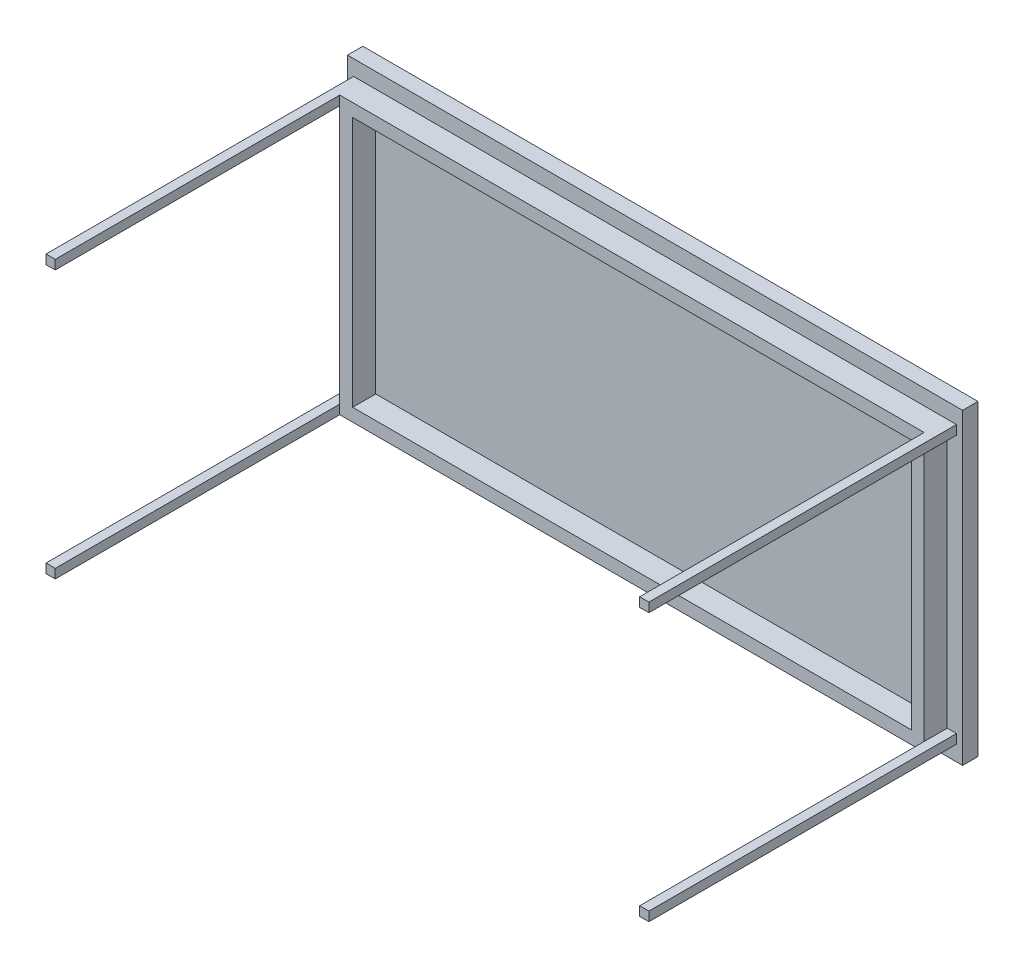
ISO-10303-21;
HEADER;
FILE_DESCRIPTION(('STEP AP214'),'2;1');
FILE_NAME('part.step','',(''),(''),'','','');
FILE_SCHEMA(('AUTOMOTIVE_DESIGN { 1 0 10303 214 1 1 1 1 }'));
ENDSEC;
DATA;
#1=APPLICATION_CONTEXT('core data for automotive mechanical design processes');
#2=APPLICATION_PROTOCOL_DEFINITION('international standard','automotive_design',2000,#1);
#3=PRODUCT_CONTEXT('',#1,'mechanical');
#4=PRODUCT('Part','Part','',(#3));
#5=PRODUCT_RELATED_PRODUCT_CATEGORY('part','',(#4));
#6=PRODUCT_DEFINITION_FORMATION('','',#4);
#7=PRODUCT_DEFINITION_CONTEXT('part definition',#1,'design');
#8=PRODUCT_DEFINITION('design','',#6,#7);
#9=PRODUCT_DEFINITION_SHAPE('','',#8);
#10=(LENGTH_UNIT() NAMED_UNIT(*) SI_UNIT(.MILLI.,.METRE.));
#11=(NAMED_UNIT(*) PLANE_ANGLE_UNIT() SI_UNIT($,.RADIAN.));
#12=(NAMED_UNIT(*) SI_UNIT($,.STERADIAN.) SOLID_ANGLE_UNIT());
#13=UNCERTAINTY_MEASURE_WITH_UNIT(LENGTH_MEASURE(1.E-05),#10,'distance_accuracy_value','');
#14=(GEOMETRIC_REPRESENTATION_CONTEXT(3) GLOBAL_UNCERTAINTY_ASSIGNED_CONTEXT((#13)) GLOBAL_UNIT_ASSIGNED_CONTEXT((#10,
#11,#12)) REPRESENTATION_CONTEXT('',''));
#15=CARTESIAN_POINT('',(0.,0.,0.));
#16=DIRECTION('',(0.,0.,1.));
#17=DIRECTION('',(1.,0.,0.));
#18=AXIS2_PLACEMENT_3D('',#15,#16,#17);
#19=CARTESIAN_POINT('',(0.,0.,50.));
#20=DIRECTION('',(0.,0.,1.));
#21=DIRECTION('',(1.,0.,0.));
#22=AXIS2_PLACEMENT_3D('',#19,#20,#21);
#23=PLANE('',#22);
#24=DIRECTION('',(0.,1.,0.));
#25=VECTOR('',#24,1.);
#26=CARTESIAN_POINT('',(1000.,499.999999999999,50.));
#27=LINE('',#26,#25);
#28=CARTESIAN_POINT('',(1000.,-500.000000000001,50.));
#29=VERTEX_POINT('',#28);
#30=CARTESIAN_POINT('',(1000.,499.999999999999,50.));
#31=VERTEX_POINT('',#30);
#32=EDGE_CURVE('E382',#29,#31,#27,.T.);
#33=ORIENTED_EDGE('',*,*,#32,.T.);
#34=DIRECTION('',(-1.,0.,0.));
#35=VECTOR('',#34,1.);
#36=CARTESIAN_POINT('',(-1000.,499.999999999999,50.));
#37=LINE('',#36,#35);
#38=CARTESIAN_POINT('',(-1000.,499.999999999999,50.));
#39=VERTEX_POINT('',#38);
#40=EDGE_CURVE('E385',#31,#39,#37,.T.);
#41=ORIENTED_EDGE('',*,*,#40,.T.);
#42=DIRECTION('',(0.,-1.,0.));
#43=VECTOR('',#42,1.);
#44=CARTESIAN_POINT('',(-1000.,499.999999999999,50.));
#45=LINE('',#44,#43);
#46=CARTESIAN_POINT('',(-1000.,-500.000000000001,50.));
#47=VERTEX_POINT('',#46);
#48=EDGE_CURVE('E388',#39,#47,#45,.T.);
#49=ORIENTED_EDGE('',*,*,#48,.T.);
#50=DIRECTION('',(1.,0.,0.));
#51=VECTOR('',#50,1.);
#52=CARTESIAN_POINT('',(-1000.,-500.000000000001,50.));
#53=LINE('',#52,#51);
#54=EDGE_CURVE('E390',#47,#29,#53,.T.);
#55=ORIENTED_EDGE('',*,*,#54,.T.);
#56=EDGE_LOOP('',(#33,#41,#49,#55));
#57=FACE_BOUND('',#56,.T.);
#58=DIRECTION('',(1.,0.,0.));
#59=VECTOR('',#58,1.);
#60=CARTESIAN_POINT('',(-950.,-450.000000000001,50.));
#61=LINE('',#60,#59);
#62=CARTESIAN_POINT('',(-980.,-449.999999999999,50.));
#63=VERTEX_POINT('',#62);
#64=CARTESIAN_POINT('',(980.,-449.999999999999,50.));
#65=VERTEX_POINT('',#64);
#66=EDGE_CURVE('E62',#63,#65,#61,.T.);
#67=ORIENTED_EDGE('',*,*,#66,.F.);
#68=DIRECTION('',(0.,-1.,0.));
#69=VECTOR('',#68,1.);
#70=CARTESIAN_POINT('',(-980.,-449.999999999999,50.));
#71=LINE('',#70,#69);
#72=CARTESIAN_POINT('',(-980.,-419.999999999999,50.));
#73=VERTEX_POINT('',#72);
#74=EDGE_CURVE('E67',#73,#63,#71,.T.);
#75=ORIENTED_EDGE('',*,*,#74,.F.);
#76=DIRECTION('',(-1.,0.,0.));
#77=VECTOR('',#76,1.);
#78=CARTESIAN_POINT('',(-980.,-419.999999999999,50.));
#79=LINE('',#78,#77);
#80=CARTESIAN_POINT('',(-950.,-419.999999999999,50.));
#81=VERTEX_POINT('',#80);
#82=EDGE_CURVE('E298',#81,#73,#79,.T.);
#83=ORIENTED_EDGE('',*,*,#82,.F.);
#84=DIRECTION('',(0.,-1.,0.));
#85=VECTOR('',#84,1.);
#86=CARTESIAN_POINT('',(-950.,449.999999999999,50.));
#87=LINE('',#86,#85);
#88=CARTESIAN_POINT('',(-950.,419.999999999999,50.));
#89=VERTEX_POINT('',#88);
#90=EDGE_CURVE('E367',#89,#81,#87,.T.);
#91=ORIENTED_EDGE('',*,*,#90,.F.);
#92=DIRECTION('',(1.,0.,0.));
#93=VECTOR('',#92,1.);
#94=CARTESIAN_POINT('',(-980.,419.999999999999,50.));
#95=LINE('',#94,#93);
#96=CARTESIAN_POINT('',(-980.,419.999999999999,50.));
#97=VERTEX_POINT('',#96);
#98=EDGE_CURVE('E249',#97,#89,#95,.T.);
#99=ORIENTED_EDGE('',*,*,#98,.F.);
#100=DIRECTION('',(0.,-1.,0.));
#101=VECTOR('',#100,1.);
#102=CARTESIAN_POINT('',(-980.,449.999999999999,50.));
#103=LINE('',#102,#101);
#104=CARTESIAN_POINT('',(-980.,449.999999999999,50.));
#105=VERTEX_POINT('',#104);
#106=EDGE_CURVE('E246',#105,#97,#103,.T.);
#107=ORIENTED_EDGE('',*,*,#106,.F.);
#108=DIRECTION('',(-1.,0.,0.));
#109=VECTOR('',#108,1.);
#110=CARTESIAN_POINT('',(950.,449.999999999999,50.));
#111=LINE('',#110,#109);
#112=CARTESIAN_POINT('',(980.,449.999999999999,50.));
#113=VERTEX_POINT('',#112);
#114=EDGE_CURVE('E244',#113,#105,#111,.T.);
#115=ORIENTED_EDGE('',*,*,#114,.F.);
#116=DIRECTION('',(0.,1.,0.));
#117=VECTOR('',#116,1.);
#118=CARTESIAN_POINT('',(980.,449.999999999999,50.));
#119=LINE('',#118,#117);
#120=CARTESIAN_POINT('',(980.,419.999999999999,50.));
#121=VERTEX_POINT('',#120);
#122=EDGE_CURVE('E232',#121,#113,#119,.T.);
#123=ORIENTED_EDGE('',*,*,#122,.F.);
#124=DIRECTION('',(1.,0.,0.));
#125=VECTOR('',#124,1.);
#126=CARTESIAN_POINT('',(980.,419.999999999999,50.));
#127=LINE('',#126,#125);
#128=CARTESIAN_POINT('',(950.,419.999999999999,50.));
#129=VERTEX_POINT('',#128);
#130=EDGE_CURVE('E220',#129,#121,#127,.T.);
#131=ORIENTED_EDGE('',*,*,#130,.F.);
#132=DIRECTION('',(0.,1.,0.));
#133=VECTOR('',#132,1.);
#134=CARTESIAN_POINT('',(950.,-450.000000000001,50.));
#135=LINE('',#134,#133);
#136=CARTESIAN_POINT('',(950.,-419.999999999999,50.));
#137=VERTEX_POINT('',#136);
#138=EDGE_CURVE('E378',#137,#129,#135,.T.);
#139=ORIENTED_EDGE('',*,*,#138,.F.);
#140=DIRECTION('',(-1.,0.,0.));
#141=VECTOR('',#140,1.);
#142=CARTESIAN_POINT('',(980.,-419.999999999999,50.));
#143=LINE('',#142,#141);
#144=CARTESIAN_POINT('',(980.,-419.999999999999,50.));
#145=VERTEX_POINT('',#144);
#146=EDGE_CURVE('E271',#145,#137,#143,.T.);
#147=ORIENTED_EDGE('',*,*,#146,.F.);
#148=DIRECTION('',(0.,1.,0.));
#149=VECTOR('',#148,1.);
#150=CARTESIAN_POINT('',(980.,-449.999999999999,50.));
#151=LINE('',#150,#149);
#152=EDGE_CURVE('E274',#65,#145,#151,.T.);
#153=ORIENTED_EDGE('',*,*,#152,.F.);
#154=EDGE_LOOP('',(#67,#75,#83,#91,#99,#107,#115,#123,#131,#139,#147,#153));
#155=FACE_BOUND('',#154,.T.);
#156=ADVANCED_FACE('F47',(#57,#155),#23,.T.);
#157=CARTESIAN_POINT('',(950.,-450.000000000001,125.));
#158=DIRECTION('',(-1.,0.,0.));
#159=DIRECTION('',(0.,0.,1.));
#160=AXIS2_PLACEMENT_3D('',#157,#158,#159);
#161=PLANE('',#160);
#162=DIRECTION('',(0.,0.,1.));
#163=VECTOR('',#162,1.);
#164=CARTESIAN_POINT('',(950.,-419.999999999999,125.));
#165=LINE('',#164,#163);
#166=CARTESIAN_POINT('',(950.,-419.999999999999,125.));
#167=VERTEX_POINT('',#166);
#168=EDGE_CURVE('E11',#137,#167,#165,.T.);
#169=ORIENTED_EDGE('',*,*,#168,.F.);
#170=ORIENTED_EDGE('',*,*,#138,.T.);
#171=DIRECTION('',(0.,0.,-1.));
#172=VECTOR('',#171,1.);
#173=CARTESIAN_POINT('',(950.,419.999999999999,1050.));
#174=LINE('',#173,#172);
#175=CARTESIAN_POINT('',(950.,419.999999999999,125.));
#176=VERTEX_POINT('',#175);
#177=EDGE_CURVE('E228',#176,#129,#174,.T.);
#178=ORIENTED_EDGE('',*,*,#177,.F.);
#179=DIRECTION('',(0.,1.,0.));
#180=VECTOR('',#179,1.);
#181=CARTESIAN_POINT('',(950.,-450.000000000001,125.));
#182=LINE('',#181,#180);
#183=EDGE_CURVE('E366',#167,#176,#182,.T.);
#184=ORIENTED_EDGE('',*,*,#183,.F.);
#185=EDGE_LOOP('',(#169,#170,#178,#184));
#186=FACE_BOUND('',#185,.T.);
#187=ADVANCED_FACE('F449',(#186),#161,.F.);
#188=CARTESIAN_POINT('',(-950.,449.999999999999,125.));
#189=DIRECTION('',(1.,0.,0.));
#190=DIRECTION('',(0.,1.,0.));
#191=AXIS2_PLACEMENT_3D('',#188,#189,#190);
#192=PLANE('',#191);
#193=DIRECTION('',(0.,0.,-1.));
#194=VECTOR('',#193,1.);
#195=CARTESIAN_POINT('',(-950.,-419.999999999999,125.));
#196=LINE('',#195,#194);
#197=CARTESIAN_POINT('',(-950.,-419.999999999999,125.));
#198=VERTEX_POINT('',#197);
#199=EDGE_CURVE('E55',#198,#81,#196,.T.);
#200=ORIENTED_EDGE('',*,*,#199,.F.);
#201=DIRECTION('',(0.,-1.,0.));
#202=VECTOR('',#201,1.);
#203=CARTESIAN_POINT('',(-950.,449.999999999999,125.));
#204=LINE('',#203,#202);
#205=CARTESIAN_POINT('',(-950.,419.999999999999,125.));
#206=VERTEX_POINT('',#205);
#207=EDGE_CURVE('E376',#206,#198,#204,.T.);
#208=ORIENTED_EDGE('',*,*,#207,.F.);
#209=DIRECTION('',(0.,0.,1.));
#210=VECTOR('',#209,1.);
#211=CARTESIAN_POINT('',(-950.,419.999999999999,125.));
#212=LINE('',#211,#210);
#213=EDGE_CURVE('E411',#89,#206,#212,.T.);
#214=ORIENTED_EDGE('',*,*,#213,.F.);
#215=ORIENTED_EDGE('',*,*,#90,.T.);
#216=EDGE_LOOP('',(#200,#208,#214,#215));
#217=FACE_BOUND('',#216,.T.);
#218=ADVANCED_FACE('F422',(#217),#192,.F.);
#219=CARTESIAN_POINT('',(1000.,499.999999999999,50.));
#220=DIRECTION('',(-1.,0.,0.));
#221=DIRECTION('',(0.,0.,1.));
#222=AXIS2_PLACEMENT_3D('',#219,#220,#221);
#223=PLANE('',#222);
#224=DIRECTION('',(0.,1.,0.));
#225=VECTOR('',#224,1.);
#226=CARTESIAN_POINT('',(1000.,499.999999999999,0.));
#227=LINE('',#226,#225);
#228=CARTESIAN_POINT('',(1000.,-500.000000000001,0.));
#229=VERTEX_POINT('',#228);
#230=CARTESIAN_POINT('',(1000.,499.999999999999,0.));
#231=VERTEX_POINT('',#230);
#232=EDGE_CURVE('E375',#229,#231,#227,.T.);
#233=ORIENTED_EDGE('',*,*,#232,.T.);
#234=DIRECTION('',(0.,0.,-1.));
#235=VECTOR('',#234,1.);
#236=CARTESIAN_POINT('',(1000.,499.999999999999,50.));
#237=LINE('',#236,#235);
#238=EDGE_CURVE('E408',#31,#231,#237,.T.);
#239=ORIENTED_EDGE('',*,*,#238,.F.);
#240=ORIENTED_EDGE('',*,*,#32,.F.);
#241=DIRECTION('',(0.,0.,-1.));
#242=VECTOR('',#241,1.);
#243=CARTESIAN_POINT('',(1000.,-500.000000000001,50.));
#244=LINE('',#243,#242);
#245=EDGE_CURVE('E392',#29,#229,#244,.T.);
#246=ORIENTED_EDGE('',*,*,#245,.T.);
#247=EDGE_LOOP('',(#233,#239,#240,#246));
#248=FACE_BOUND('',#247,.T.);
#249=ADVANCED_FACE('F49',(#248),#223,.F.);
#250=CARTESIAN_POINT('',(-1000.,499.999999999999,50.));
#251=DIRECTION('',(0.,-1.,0.));
#252=DIRECTION('',(0.,0.,-1.));
#253=AXIS2_PLACEMENT_3D('',#250,#251,#252);
#254=PLANE('',#253);
#255=DIRECTION('',(-1.,0.,0.));
#256=VECTOR('',#255,1.);
#257=CARTESIAN_POINT('',(-1000.,499.999999999999,0.));
#258=LINE('',#257,#256);
#259=CARTESIAN_POINT('',(-1000.,499.999999999999,0.));
#260=VERTEX_POINT('',#259);
#261=EDGE_CURVE('E395',#231,#260,#258,.T.);
#262=ORIENTED_EDGE('',*,*,#261,.T.);
#263=DIRECTION('',(0.,0.,-1.));
#264=VECTOR('',#263,1.);
#265=CARTESIAN_POINT('',(-1000.,499.999999999999,50.));
#266=LINE('',#265,#264);
#267=EDGE_CURVE('E405',#39,#260,#266,.T.);
#268=ORIENTED_EDGE('',*,*,#267,.F.);
#269=ORIENTED_EDGE('',*,*,#40,.F.);
#270=ORIENTED_EDGE('',*,*,#238,.T.);
#271=EDGE_LOOP('',(#262,#268,#269,#270));
#272=FACE_BOUND('',#271,.T.);
#273=ADVANCED_FACE('F858',(#272),#254,.F.);
#274=CARTESIAN_POINT('',(-1000.,499.999999999999,50.));
#275=DIRECTION('',(1.,0.,0.));
#276=DIRECTION('',(0.,1.,0.));
#277=AXIS2_PLACEMENT_3D('',#274,#275,#276);
#278=PLANE('',#277);
#279=DIRECTION('',(0.,-1.,0.));
#280=VECTOR('',#279,1.);
#281=CARTESIAN_POINT('',(-1000.,499.999999999999,0.));
#282=LINE('',#281,#280);
#283=CARTESIAN_POINT('',(-1000.,-500.000000000001,0.));
#284=VERTEX_POINT('',#283);
#285=EDGE_CURVE('E397',#260,#284,#282,.T.);
#286=ORIENTED_EDGE('',*,*,#285,.T.);
#287=DIRECTION('',(0.,0.,-1.));
#288=VECTOR('',#287,1.);
#289=CARTESIAN_POINT('',(-1000.,-500.000000000001,50.));
#290=LINE('',#289,#288);
#291=EDGE_CURVE('E402',#47,#284,#290,.T.);
#292=ORIENTED_EDGE('',*,*,#291,.F.);
#293=ORIENTED_EDGE('',*,*,#48,.F.);
#294=ORIENTED_EDGE('',*,*,#267,.T.);
#295=EDGE_LOOP('',(#286,#292,#293,#294));
#296=FACE_BOUND('',#295,.T.);
#297=ADVANCED_FACE('F846',(#296),#278,.F.);
#298=CARTESIAN_POINT('',(-1000.,-500.000000000001,50.));
#299=DIRECTION('',(0.,1.,0.));
#300=DIRECTION('',(0.,0.,1.));
#301=AXIS2_PLACEMENT_3D('',#298,#299,#300);
#302=PLANE('',#301);
#303=DIRECTION('',(1.,0.,0.));
#304=VECTOR('',#303,1.);
#305=CARTESIAN_POINT('',(-1000.,-500.000000000001,0.));
#306=LINE('',#305,#304);
#307=EDGE_CURVE('E386',#284,#229,#306,.T.);
#308=ORIENTED_EDGE('',*,*,#307,.T.);
#309=ORIENTED_EDGE('',*,*,#245,.F.);
#310=ORIENTED_EDGE('',*,*,#54,.F.);
#311=ORIENTED_EDGE('',*,*,#291,.T.);
#312=EDGE_LOOP('',(#308,#309,#310,#311));
#313=FACE_BOUND('',#312,.T.);
#314=ADVANCED_FACE('F835',(#313),#302,.F.);
#315=CARTESIAN_POINT('',(0.,0.,0.));
#316=DIRECTION('',(0.,0.,1.));
#317=DIRECTION('',(1.,0.,0.));
#318=AXIS2_PLACEMENT_3D('',#315,#316,#317);
#319=PLANE('',#318);
#320=ORIENTED_EDGE('',*,*,#232,.F.);
#321=ORIENTED_EDGE('',*,*,#307,.F.);
#322=ORIENTED_EDGE('',*,*,#285,.F.);
#323=ORIENTED_EDGE('',*,*,#261,.F.);
#324=EDGE_LOOP('',(#320,#321,#322,#323));
#325=FACE_BOUND('',#324,.T.);
#326=ADVANCED_FACE('F522',(#325),#319,.F.);
#327=CARTESIAN_POINT('',(0.,0.,125.));
#328=DIRECTION('',(0.,0.,1.));
#329=DIRECTION('',(1.,0.,0.));
#330=AXIS2_PLACEMENT_3D('',#327,#328,#329);
#331=PLANE('',#330);
#332=DIRECTION('',(1.,0.,0.));
#333=VECTOR('',#332,1.);
#334=CARTESIAN_POINT('',(-950.,-450.000000000001,125.));
#335=LINE('',#334,#333);
#336=CARTESIAN_POINT('',(-950.,-450.000000000001,125.));
#337=VERTEX_POINT('',#336);
#338=CARTESIAN_POINT('',(950.,-450.000000000001,125.));
#339=VERTEX_POINT('',#338);
#340=EDGE_CURVE('E364',#337,#339,#335,.T.);
#341=ORIENTED_EDGE('',*,*,#340,.T.);
#342=EDGE_CURVE('E368',#339,#167,#182,.T.);
#343=ORIENTED_EDGE('',*,*,#342,.T.);
#344=ORIENTED_EDGE('',*,*,#183,.T.);
#345=DIRECTION('',(0.,1.,0.));
#346=VECTOR('',#345,1.);
#347=CARTESIAN_POINT('',(950.,0.,125.));
#348=LINE('',#347,#346);
#349=CARTESIAN_POINT('',(950.,449.999999999999,125.));
#350=VERTEX_POINT('',#349);
#351=EDGE_CURVE('E332',#176,#350,#348,.T.);
#352=ORIENTED_EDGE('',*,*,#351,.T.);
#353=DIRECTION('',(-1.,0.,0.));
#354=VECTOR('',#353,1.);
#355=CARTESIAN_POINT('',(950.,449.999999999999,125.));
#356=LINE('',#355,#354);
#357=CARTESIAN_POINT('',(-950.,449.999999999999,125.));
#358=VERTEX_POINT('',#357);
#359=EDGE_CURVE('E370',#350,#358,#356,.T.);
#360=ORIENTED_EDGE('',*,*,#359,.T.);
#361=EDGE_CURVE('E373',#358,#206,#204,.T.);
#362=ORIENTED_EDGE('',*,*,#361,.T.);
#363=ORIENTED_EDGE('',*,*,#207,.T.);
#364=EDGE_CURVE('E372',#198,#337,#204,.T.);
#365=ORIENTED_EDGE('',*,*,#364,.T.);
#366=EDGE_LOOP('',(#341,#343,#344,#352,#360,#362,#363,#365));
#367=FACE_BOUND('',#366,.T.);
#368=DIRECTION('',(0.,1.,0.));
#369=VECTOR('',#368,1.);
#370=CARTESIAN_POINT('',(908.,-408.000000000001,125.));
#371=LINE('',#370,#369);
#372=CARTESIAN_POINT('',(908.,-408.000000000001,125.));
#373=VERTEX_POINT('',#372);
#374=CARTESIAN_POINT('',(908.,407.999999999999,125.));
#375=VERTEX_POINT('',#374);
#376=EDGE_CURVE('E338',#373,#375,#371,.T.);
#377=ORIENTED_EDGE('',*,*,#376,.F.);
#378=DIRECTION('',(1.,0.,0.));
#379=VECTOR('',#378,1.);
#380=CARTESIAN_POINT('',(-908.,-408.000000000001,125.));
#381=LINE('',#380,#379);
#382=CARTESIAN_POINT('',(-908.,-408.000000000001,125.));
#383=VERTEX_POINT('',#382);
#384=EDGE_CURVE('E336',#383,#373,#381,.T.);
#385=ORIENTED_EDGE('',*,*,#384,.F.);
#386=DIRECTION('',(0.,-1.,0.));
#387=VECTOR('',#386,1.);
#388=CARTESIAN_POINT('',(-908.,407.999999999999,125.));
#389=LINE('',#388,#387);
#390=CARTESIAN_POINT('',(-908.,407.999999999999,125.));
#391=VERTEX_POINT('',#390);
#392=EDGE_CURVE('E344',#391,#383,#389,.T.);
#393=ORIENTED_EDGE('',*,*,#392,.F.);
#394=DIRECTION('',(-1.,0.,0.));
#395=VECTOR('',#394,1.);
#396=CARTESIAN_POINT('',(908.,407.999999999999,125.));
#397=LINE('',#396,#395);
#398=EDGE_CURVE('E341',#375,#391,#397,.T.);
#399=ORIENTED_EDGE('',*,*,#398,.F.);
#400=EDGE_LOOP('',(#377,#385,#393,#399));
#401=FACE_BOUND('',#400,.T.);
#402=ADVANCED_FACE('F426',(#367,#401),#331,.T.);
#403=CARTESIAN_POINT('',(-950.,-450.000000000001,125.));
#404=DIRECTION('',(0.,1.,0.));
#405=DIRECTION('',(0.,0.,1.));
#406=AXIS2_PLACEMENT_3D('',#403,#404,#405);
#407=PLANE('',#406);
#408=ORIENTED_EDGE('',*,*,#66,.T.);
#409=DIRECTION('',(0.,0.,-1.));
#410=VECTOR('',#409,1.);
#411=CARTESIAN_POINT('',(980.,-449.999999999999,1050.));
#412=LINE('',#411,#410);
#413=CARTESIAN_POINT('',(980.,-449.999999999999,1050.));
#414=VERTEX_POINT('',#413);
#415=EDGE_CURVE('E258',#414,#65,#412,.T.);
#416=ORIENTED_EDGE('',*,*,#415,.F.);
#417=DIRECTION('',(1.,0.,0.));
#418=VECTOR('',#417,1.);
#419=CARTESIAN_POINT('',(950.,-449.999999999999,1050.));
#420=LINE('',#419,#418);
#421=CARTESIAN_POINT('',(950.,-449.999999999999,1050.));
#422=VERTEX_POINT('',#421);
#423=EDGE_CURVE('E275',#422,#414,#420,.T.);
#424=ORIENTED_EDGE('',*,*,#423,.F.);
#425=DIRECTION('',(0.,0.,-1.));
#426=VECTOR('',#425,1.);
#427=CARTESIAN_POINT('',(950.,-449.999999999999,1050.));
#428=LINE('',#427,#426);
#429=EDGE_CURVE('E267',#422,#339,#428,.T.);
#430=ORIENTED_EDGE('',*,*,#429,.T.);
#431=ORIENTED_EDGE('',*,*,#340,.F.);
#432=DIRECTION('',(0.,0.,-1.));
#433=VECTOR('',#432,1.);
#434=CARTESIAN_POINT('',(-950.,-449.999999999999,1050.));
#435=LINE('',#434,#433);
#436=CARTESIAN_POINT('',(-950.,-449.999999999999,1050.));
#437=VERTEX_POINT('',#436);
#438=EDGE_CURVE('E288',#437,#337,#435,.T.);
#439=ORIENTED_EDGE('',*,*,#438,.F.);
#440=DIRECTION('',(1.,0.,0.));
#441=VECTOR('',#440,1.);
#442=CARTESIAN_POINT('',(-950.,-449.999999999999,1050.));
#443=LINE('',#442,#441);
#444=CARTESIAN_POINT('',(-980.,-449.999999999999,1050.));
#445=VERTEX_POINT('',#444);
#446=EDGE_CURVE('E305',#445,#437,#443,.T.);
#447=ORIENTED_EDGE('',*,*,#446,.F.);
#448=DIRECTION('',(0.,0.,-1.));
#449=VECTOR('',#448,1.);
#450=CARTESIAN_POINT('',(-980.,-449.999999999999,1050.));
#451=LINE('',#450,#449);
#452=EDGE_CURVE('E286',#445,#63,#451,.T.);
#453=ORIENTED_EDGE('',*,*,#452,.T.);
#454=EDGE_LOOP('',(#408,#416,#424,#430,#431,#439,#447,#453));
#455=FACE_BOUND('',#454,.T.);
#456=ADVANCED_FACE('F435',(#455),#407,.F.);
#457=CARTESIAN_POINT('',(950.,449.999999999999,125.));
#458=DIRECTION('',(0.,-1.,0.));
#459=DIRECTION('',(0.,0.,-1.));
#460=AXIS2_PLACEMENT_3D('',#457,#458,#459);
#461=PLANE('',#460);
#462=ORIENTED_EDGE('',*,*,#114,.T.);
#463=DIRECTION('',(0.,0.,-1.));
#464=VECTOR('',#463,1.);
#465=CARTESIAN_POINT('',(-980.,449.999999999999,1050.));
#466=LINE('',#465,#464);
#467=CARTESIAN_POINT('',(-980.,449.999999999999,1050.));
#468=VERTEX_POINT('',#467);
#469=EDGE_CURVE('E326',#468,#105,#466,.T.);
#470=ORIENTED_EDGE('',*,*,#469,.F.);
#471=DIRECTION('',(-1.,0.,0.));
#472=VECTOR('',#471,1.);
#473=CARTESIAN_POINT('',(-950.,449.999999999999,1050.));
#474=LINE('',#473,#472);
#475=CARTESIAN_POINT('',(-950.,449.999999999999,1050.));
#476=VERTEX_POINT('',#475);
#477=EDGE_CURVE('E312',#476,#468,#474,.T.);
#478=ORIENTED_EDGE('',*,*,#477,.F.);
#479=DIRECTION('',(0.,0.,-1.));
#480=VECTOR('',#479,1.);
#481=CARTESIAN_POINT('',(-950.,449.999999999999,1050.));
#482=LINE('',#481,#480);
#483=EDGE_CURVE('E329',#476,#358,#482,.T.);
#484=ORIENTED_EDGE('',*,*,#483,.T.);
#485=ORIENTED_EDGE('',*,*,#359,.F.);
#486=DIRECTION('',(0.,0.,-1.));
#487=VECTOR('',#486,1.);
#488=CARTESIAN_POINT('',(950.,449.999999999999,1050.));
#489=LINE('',#488,#487);
#490=CARTESIAN_POINT('',(950.,449.999999999999,1050.));
#491=VERTEX_POINT('',#490);
#492=EDGE_CURVE('E911',#491,#350,#489,.T.);
#493=ORIENTED_EDGE('',*,*,#492,.F.);
#494=DIRECTION('',(-1.,0.,0.));
#495=VECTOR('',#494,1.);
#496=CARTESIAN_POINT('',(950.,449.999999999999,1050.));
#497=LINE('',#496,#495);
#498=CARTESIAN_POINT('',(980.,449.999999999999,1050.));
#499=VERTEX_POINT('',#498);
#500=EDGE_CURVE('E255',#499,#491,#497,.T.);
#501=ORIENTED_EDGE('',*,*,#500,.F.);
#502=DIRECTION('',(0.,0.,-1.));
#503=VECTOR('',#502,1.);
#504=CARTESIAN_POINT('',(980.,449.999999999999,1050.));
#505=LINE('',#504,#503);
#506=EDGE_CURVE('E278',#499,#113,#505,.T.);
#507=ORIENTED_EDGE('',*,*,#506,.T.);
#508=EDGE_LOOP('',(#462,#470,#478,#484,#485,#493,#501,#507));
#509=FACE_BOUND('',#508,.T.);
#510=ADVANCED_FACE('F519',(#509),#461,.F.);
#511=CARTESIAN_POINT('',(-908.,-408.000000000001,125.));
#512=DIRECTION('',(0.,1.,0.));
#513=DIRECTION('',(0.,0.,1.));
#514=AXIS2_PLACEMENT_3D('',#511,#512,#513);
#515=PLANE('',#514);
#516=DIRECTION('',(1.,0.,0.));
#517=VECTOR('',#516,1.);
#518=CARTESIAN_POINT('',(-908.,-408.000000000001,50.));
#519=LINE('',#518,#517);
#520=CARTESIAN_POINT('',(-908.,-408.000000000001,50.));
#521=VERTEX_POINT('',#520);
#522=CARTESIAN_POINT('',(908.,-408.000000000001,50.));
#523=VERTEX_POINT('',#522);
#524=EDGE_CURVE('E335',#521,#523,#519,.T.);
#525=ORIENTED_EDGE('',*,*,#524,.F.);
#526=DIRECTION('',(0.,0.,-1.));
#527=VECTOR('',#526,1.);
#528=CARTESIAN_POINT('',(-908.,-408.000000000001,125.));
#529=LINE('',#528,#527);
#530=EDGE_CURVE('E346',#383,#521,#529,.T.);
#531=ORIENTED_EDGE('',*,*,#530,.F.);
#532=ORIENTED_EDGE('',*,*,#384,.T.);
#533=DIRECTION('',(0.,0.,-1.));
#534=VECTOR('',#533,1.);
#535=CARTESIAN_POINT('',(908.,-408.000000000001,125.));
#536=LINE('',#535,#534);
#537=EDGE_CURVE('E361',#373,#523,#536,.T.);
#538=ORIENTED_EDGE('',*,*,#537,.T.);
#539=EDGE_LOOP('',(#525,#531,#532,#538));
#540=FACE_BOUND('',#539,.T.);
#541=ADVANCED_FACE('F505',(#540),#515,.T.);
#542=CARTESIAN_POINT('',(908.,-408.000000000001,125.));
#543=DIRECTION('',(-1.,0.,0.));
#544=DIRECTION('',(0.,0.,1.));
#545=AXIS2_PLACEMENT_3D('',#542,#543,#544);
#546=PLANE('',#545);
#547=DIRECTION('',(0.,1.,0.));
#548=VECTOR('',#547,1.);
#549=CARTESIAN_POINT('',(908.,-408.000000000001,50.));
#550=LINE('',#549,#548);
#551=CARTESIAN_POINT('',(908.,407.999999999999,50.));
#552=VERTEX_POINT('',#551);
#553=EDGE_CURVE('E348',#523,#552,#550,.T.);
#554=ORIENTED_EDGE('',*,*,#553,.F.);
#555=ORIENTED_EDGE('',*,*,#537,.F.);
#556=ORIENTED_EDGE('',*,*,#376,.T.);
#557=DIRECTION('',(0.,0.,-1.));
#558=VECTOR('',#557,1.);
#559=CARTESIAN_POINT('',(908.,407.999999999999,125.));
#560=LINE('',#559,#558);
#561=EDGE_CURVE('E358',#375,#552,#560,.T.);
#562=ORIENTED_EDGE('',*,*,#561,.T.);
#563=EDGE_LOOP('',(#554,#555,#556,#562));
#564=FACE_BOUND('',#563,.T.);
#565=ADVANCED_FACE('F501',(#564),#546,.T.);
#566=CARTESIAN_POINT('',(908.,407.999999999999,125.));
#567=DIRECTION('',(0.,-1.,0.));
#568=DIRECTION('',(0.,0.,-1.));
#569=AXIS2_PLACEMENT_3D('',#566,#567,#568);
#570=PLANE('',#569);
#571=DIRECTION('',(-1.,0.,0.));
#572=VECTOR('',#571,1.);
#573=CARTESIAN_POINT('',(908.,407.999999999999,50.));
#574=LINE('',#573,#572);
#575=CARTESIAN_POINT('',(-908.,407.999999999999,50.));
#576=VERTEX_POINT('',#575);
#577=EDGE_CURVE('E350',#552,#576,#574,.T.);
#578=ORIENTED_EDGE('',*,*,#577,.F.);
#579=ORIENTED_EDGE('',*,*,#561,.F.);
#580=ORIENTED_EDGE('',*,*,#398,.T.);
#581=DIRECTION('',(0.,0.,-1.));
#582=VECTOR('',#581,1.);
#583=CARTESIAN_POINT('',(-908.,407.999999999999,125.));
#584=LINE('',#583,#582);
#585=EDGE_CURVE('E355',#391,#576,#584,.T.);
#586=ORIENTED_EDGE('',*,*,#585,.T.);
#587=EDGE_LOOP('',(#578,#579,#580,#586));
#588=FACE_BOUND('',#587,.T.);
#589=ADVANCED_FACE('F491',(#588),#570,.T.);
#590=CARTESIAN_POINT('',(-908.,407.999999999999,125.));
#591=DIRECTION('',(1.,0.,0.));
#592=DIRECTION('',(0.,0.,-1.));
#593=AXIS2_PLACEMENT_3D('',#590,#591,#592);
#594=PLANE('',#593);
#595=DIRECTION('',(0.,-1.,0.));
#596=VECTOR('',#595,1.);
#597=CARTESIAN_POINT('',(-908.,407.999999999999,50.));
#598=LINE('',#597,#596);
#599=EDGE_CURVE('E339',#576,#521,#598,.T.);
#600=ORIENTED_EDGE('',*,*,#599,.F.);
#601=ORIENTED_EDGE('',*,*,#585,.F.);
#602=ORIENTED_EDGE('',*,*,#392,.T.);
#603=ORIENTED_EDGE('',*,*,#530,.T.);
#604=EDGE_LOOP('',(#600,#601,#602,#603));
#605=FACE_BOUND('',#604,.T.);
#606=ADVANCED_FACE('F482',(#605),#594,.T.);
#607=ORIENTED_EDGE('',*,*,#524,.T.);
#608=ORIENTED_EDGE('',*,*,#553,.T.);
#609=ORIENTED_EDGE('',*,*,#577,.T.);
#610=ORIENTED_EDGE('',*,*,#599,.T.);
#611=EDGE_LOOP('',(#607,#608,#609,#610));
#612=FACE_BOUND('',#611,.T.);
#613=ADVANCED_FACE('F473',(#612),#23,.T.);
#614=CARTESIAN_POINT('',(-950.,419.999999999999,1050.));
#615=DIRECTION('',(-1.,0.,0.));
#616=DIRECTION('',(0.,0.,1.));
#617=AXIS2_PLACEMENT_3D('',#614,#615,#616);
#618=PLANE('',#617);
#619=ORIENTED_EDGE('',*,*,#361,.F.);
#620=ORIENTED_EDGE('',*,*,#483,.F.);
#621=DIRECTION('',(0.,1.,0.));
#622=VECTOR('',#621,1.);
#623=CARTESIAN_POINT('',(-950.,419.999999999999,1050.));
#624=LINE('',#623,#622);
#625=CARTESIAN_POINT('',(-950.,419.999999999999,1050.));
#626=VERTEX_POINT('',#625);
#627=EDGE_CURVE('E309',#626,#476,#624,.T.);
#628=ORIENTED_EDGE('',*,*,#627,.F.);
#629=DIRECTION('',(0.,0.,-1.));
#630=VECTOR('',#629,1.);
#631=CARTESIAN_POINT('',(-950.,419.999999999999,1050.));
#632=LINE('',#631,#630);
#633=EDGE_CURVE('E317',#626,#206,#632,.T.);
#634=ORIENTED_EDGE('',*,*,#633,.T.);
#635=EDGE_LOOP('',(#619,#620,#628,#634));
#636=FACE_BOUND('',#635,.T.);
#637=ADVANCED_FACE('F481',(#636),#618,.F.);
#638=CARTESIAN_POINT('',(-980.,449.999999999999,1050.));
#639=DIRECTION('',(1.,0.,0.));
#640=DIRECTION('',(0.,0.,-1.));
#641=AXIS2_PLACEMENT_3D('',#638,#639,#640);
#642=PLANE('',#641);
#643=ORIENTED_EDGE('',*,*,#106,.T.);
#644=DIRECTION('',(0.,0.,-1.));
#645=VECTOR('',#644,1.);
#646=CARTESIAN_POINT('',(-980.,419.999999999999,1050.));
#647=LINE('',#646,#645);
#648=CARTESIAN_POINT('',(-980.,419.999999999999,1050.));
#649=VERTEX_POINT('',#648);
#650=EDGE_CURVE('E323',#649,#97,#647,.T.);
#651=ORIENTED_EDGE('',*,*,#650,.F.);
#652=DIRECTION('',(0.,-1.,0.));
#653=VECTOR('',#652,1.);
#654=CARTESIAN_POINT('',(-980.,449.999999999999,1050.));
#655=LINE('',#654,#653);
#656=EDGE_CURVE('E314',#468,#649,#655,.T.);
#657=ORIENTED_EDGE('',*,*,#656,.F.);
#658=ORIENTED_EDGE('',*,*,#469,.T.);
#659=EDGE_LOOP('',(#643,#651,#657,#658));
#660=FACE_BOUND('',#659,.T.);
#661=ADVANCED_FACE('F488',(#660),#642,.F.);
#662=CARTESIAN_POINT('',(-980.,419.999999999999,1050.));
#663=DIRECTION('',(0.,1.,0.));
#664=DIRECTION('',(0.,0.,1.));
#665=AXIS2_PLACEMENT_3D('',#662,#663,#664);
#666=PLANE('',#665);
#667=ORIENTED_EDGE('',*,*,#98,.T.);
#668=ORIENTED_EDGE('',*,*,#213,.T.);
#669=ORIENTED_EDGE('',*,*,#633,.F.);
#670=DIRECTION('',(1.,0.,0.));
#671=VECTOR('',#670,1.);
#672=CARTESIAN_POINT('',(-980.,419.999999999999,1050.));
#673=LINE('',#672,#671);
#674=EDGE_CURVE('E316',#649,#626,#673,.T.);
#675=ORIENTED_EDGE('',*,*,#674,.F.);
#676=ORIENTED_EDGE('',*,*,#650,.T.);
#677=EDGE_LOOP('',(#667,#668,#669,#675,#676));
#678=FACE_BOUND('',#677,.T.);
#679=ADVANCED_FACE('F575',(#678),#666,.F.);
#680=CARTESIAN_POINT('',(0.,0.,1050.));
#681=DIRECTION('',(0.,0.,1.));
#682=DIRECTION('',(1.,0.,0.));
#683=AXIS2_PLACEMENT_3D('',#680,#681,#682);
#684=PLANE('',#683);
#685=ORIENTED_EDGE('',*,*,#627,.T.);
#686=ORIENTED_EDGE('',*,*,#477,.T.);
#687=ORIENTED_EDGE('',*,*,#656,.T.);
#688=ORIENTED_EDGE('',*,*,#674,.T.);
#689=EDGE_LOOP('',(#685,#686,#687,#688));
#690=FACE_BOUND('',#689,.T.);
#691=ADVANCED_FACE('F585',(#690),#684,.T.);
#692=CARTESIAN_POINT('',(-980.,-449.999999999999,1050.));
#693=DIRECTION('',(1.,0.,0.));
#694=DIRECTION('',(0.,0.,-1.));
#695=AXIS2_PLACEMENT_3D('',#692,#693,#694);
#696=PLANE('',#695);
#697=ORIENTED_EDGE('',*,*,#74,.T.);
#698=ORIENTED_EDGE('',*,*,#452,.F.);
#699=DIRECTION('',(0.,-1.,0.));
#700=VECTOR('',#699,1.);
#701=CARTESIAN_POINT('',(-980.,-449.999999999999,1050.));
#702=LINE('',#701,#700);
#703=CARTESIAN_POINT('',(-980.,-419.999999999999,1050.));
#704=VERTEX_POINT('',#703);
#705=EDGE_CURVE('E300',#704,#445,#702,.T.);
#706=ORIENTED_EDGE('',*,*,#705,.F.);
#707=DIRECTION('',(0.,0.,-1.));
#708=VECTOR('',#707,1.);
#709=CARTESIAN_POINT('',(-980.,-419.999999999999,1050.));
#710=LINE('',#709,#708);
#711=EDGE_CURVE('E294',#704,#73,#710,.T.);
#712=ORIENTED_EDGE('',*,*,#711,.T.);
#713=EDGE_LOOP('',(#697,#698,#706,#712));
#714=FACE_BOUND('',#713,.T.);
#715=ADVANCED_FACE('F457',(#714),#696,.F.);
#716=CARTESIAN_POINT('',(-950.,-419.999999999999,1050.));
#717=DIRECTION('',(-1.,0.,0.));
#718=DIRECTION('',(0.,0.,1.));
#719=AXIS2_PLACEMENT_3D('',#716,#717,#718);
#720=PLANE('',#719);
#721=ORIENTED_EDGE('',*,*,#364,.F.);
#722=DIRECTION('',(0.,0.,-1.));
#723=VECTOR('',#722,1.);
#724=CARTESIAN_POINT('',(-950.,-419.999999999999,1050.));
#725=LINE('',#724,#723);
#726=CARTESIAN_POINT('',(-950.,-419.999999999999,1050.));
#727=VERTEX_POINT('',#726);
#728=EDGE_CURVE('E291',#727,#198,#725,.T.);
#729=ORIENTED_EDGE('',*,*,#728,.F.);
#730=DIRECTION('',(0.,1.,0.));
#731=VECTOR('',#730,1.);
#732=CARTESIAN_POINT('',(-950.,-419.999999999999,1050.));
#733=LINE('',#732,#731);
#734=EDGE_CURVE('E303',#437,#727,#733,.T.);
#735=ORIENTED_EDGE('',*,*,#734,.F.);
#736=ORIENTED_EDGE('',*,*,#438,.T.);
#737=EDGE_LOOP('',(#721,#729,#735,#736));
#738=FACE_BOUND('',#737,.T.);
#739=ADVANCED_FACE('F431',(#738),#720,.F.);
#740=CARTESIAN_POINT('',(-980.,-419.999999999999,1050.));
#741=DIRECTION('',(0.,-1.,0.));
#742=DIRECTION('',(0.,0.,-1.));
#743=AXIS2_PLACEMENT_3D('',#740,#741,#742);
#744=PLANE('',#743);
#745=ORIENTED_EDGE('',*,*,#82,.T.);
#746=ORIENTED_EDGE('',*,*,#711,.F.);
#747=DIRECTION('',(-1.,0.,0.));
#748=VECTOR('',#747,1.);
#749=CARTESIAN_POINT('',(-980.,-419.999999999999,1050.));
#750=LINE('',#749,#748);
#751=EDGE_CURVE('E297',#727,#704,#750,.T.);
#752=ORIENTED_EDGE('',*,*,#751,.F.);
#753=ORIENTED_EDGE('',*,*,#728,.T.);
#754=ORIENTED_EDGE('',*,*,#199,.T.);
#755=EDGE_LOOP('',(#745,#746,#752,#753,#754));
#756=FACE_BOUND('',#755,.T.);
#757=ADVANCED_FACE('F415',(#756),#744,.F.);
#758=CARTESIAN_POINT('',(0.,0.,1050.));
#759=DIRECTION('',(0.,0.,-1.));
#760=DIRECTION('',(-1.,0.,0.));
#761=AXIS2_PLACEMENT_3D('',#758,#759,#760);
#762=PLANE('',#761);
#763=ORIENTED_EDGE('',*,*,#705,.T.);
#764=ORIENTED_EDGE('',*,*,#446,.T.);
#765=ORIENTED_EDGE('',*,*,#734,.T.);
#766=ORIENTED_EDGE('',*,*,#751,.T.);
#767=EDGE_LOOP('',(#763,#764,#765,#766));
#768=FACE_BOUND('',#767,.T.);
#769=ADVANCED_FACE('F459',(#768),#762,.F.);
#770=CARTESIAN_POINT('',(980.,449.999999999999,1050.));
#771=DIRECTION('',(-1.,0.,0.));
#772=DIRECTION('',(0.,0.,1.));
#773=AXIS2_PLACEMENT_3D('',#770,#771,#772);
#774=PLANE('',#773);
#775=ORIENTED_EDGE('',*,*,#122,.T.);
#776=ORIENTED_EDGE('',*,*,#506,.F.);
#777=DIRECTION('',(0.,1.,0.));
#778=VECTOR('',#777,1.);
#779=CARTESIAN_POINT('',(980.,449.999999999999,1050.));
#780=LINE('',#779,#778);
#781=CARTESIAN_POINT('',(980.,419.999999999999,1050.));
#782=VERTEX_POINT('',#781);
#783=EDGE_CURVE('E233',#782,#499,#780,.T.);
#784=ORIENTED_EDGE('',*,*,#783,.F.);
#785=DIRECTION('',(0.,0.,-1.));
#786=VECTOR('',#785,1.);
#787=CARTESIAN_POINT('',(980.,419.999999999999,1050.));
#788=LINE('',#787,#786);
#789=EDGE_CURVE('E224',#782,#121,#788,.T.);
#790=ORIENTED_EDGE('',*,*,#789,.T.);
#791=EDGE_LOOP('',(#775,#776,#784,#790));
#792=FACE_BOUND('',#791,.T.);
#793=ADVANCED_FACE('F237',(#792),#774,.F.);
#794=CARTESIAN_POINT('',(950.,419.999999999999,1050.));
#795=DIRECTION('',(1.,0.,0.));
#796=DIRECTION('',(0.,0.,-1.));
#797=AXIS2_PLACEMENT_3D('',#794,#795,#796);
#798=PLANE('',#797);
#799=ORIENTED_EDGE('',*,*,#351,.F.);
#800=CARTESIAN_POINT('',(950.,419.999999999999,1050.));
#801=VERTEX_POINT('',#800);
#802=EDGE_CURVE('E241',#801,#176,#174,.T.);
#803=ORIENTED_EDGE('',*,*,#802,.F.);
#804=DIRECTION('',(0.,-1.,0.));
#805=VECTOR('',#804,1.);
#806=CARTESIAN_POINT('',(950.,419.999999999999,1050.));
#807=LINE('',#806,#805);
#808=EDGE_CURVE('E253',#491,#801,#807,.T.);
#809=ORIENTED_EDGE('',*,*,#808,.F.);
#810=ORIENTED_EDGE('',*,*,#492,.T.);
#811=EDGE_LOOP('',(#799,#803,#809,#810));
#812=FACE_BOUND('',#811,.T.);
#813=ADVANCED_FACE('F466',(#812),#798,.F.);
#814=CARTESIAN_POINT('',(980.,419.999999999999,1050.));
#815=DIRECTION('',(0.,1.,0.));
#816=DIRECTION('',(0.,0.,1.));
#817=AXIS2_PLACEMENT_3D('',#814,#815,#816);
#818=PLANE('',#817);
#819=ORIENTED_EDGE('',*,*,#130,.T.);
#820=ORIENTED_EDGE('',*,*,#789,.F.);
#821=DIRECTION('',(1.,0.,0.));
#822=VECTOR('',#821,1.);
#823=CARTESIAN_POINT('',(980.,419.999999999999,1050.));
#824=LINE('',#823,#822);
#825=EDGE_CURVE('E240',#801,#782,#824,.T.);
#826=ORIENTED_EDGE('',*,*,#825,.F.);
#827=ORIENTED_EDGE('',*,*,#802,.T.);
#828=ORIENTED_EDGE('',*,*,#177,.T.);
#829=EDGE_LOOP('',(#819,#820,#826,#827,#828));
#830=FACE_BOUND('',#829,.T.);
#831=ADVANCED_FACE('F222',(#830),#818,.F.);
#832=CARTESIAN_POINT('',(0.,0.,1050.));
#833=DIRECTION('',(0.,0.,-1.));
#834=DIRECTION('',(-1.,0.,0.));
#835=AXIS2_PLACEMENT_3D('',#832,#833,#834);
#836=PLANE('',#835);
#837=ORIENTED_EDGE('',*,*,#783,.T.);
#838=ORIENTED_EDGE('',*,*,#500,.T.);
#839=ORIENTED_EDGE('',*,*,#808,.T.);
#840=ORIENTED_EDGE('',*,*,#825,.T.);
#841=EDGE_LOOP('',(#837,#838,#839,#840));
#842=FACE_BOUND('',#841,.T.);
#843=ADVANCED_FACE('F644',(#842),#836,.F.);
#844=CARTESIAN_POINT('',(980.,-449.999999999999,1050.));
#845=DIRECTION('',(-1.,0.,0.));
#846=DIRECTION('',(0.,0.,1.));
#847=AXIS2_PLACEMENT_3D('',#844,#845,#846);
#848=PLANE('',#847);
#849=ORIENTED_EDGE('',*,*,#152,.T.);
#850=DIRECTION('',(0.,0.,-1.));
#851=VECTOR('',#850,1.);
#852=CARTESIAN_POINT('',(980.,-419.999999999999,1050.));
#853=LINE('',#852,#851);
#854=CARTESIAN_POINT('',(980.,-419.999999999999,1050.));
#855=VERTEX_POINT('',#854);
#856=EDGE_CURVE('E261',#855,#145,#853,.T.);
#857=ORIENTED_EDGE('',*,*,#856,.F.);
#858=DIRECTION('',(0.,1.,0.));
#859=VECTOR('',#858,1.);
#860=CARTESIAN_POINT('',(980.,-449.999999999999,1050.));
#861=LINE('',#860,#859);
#862=EDGE_CURVE('E282',#414,#855,#861,.T.);
#863=ORIENTED_EDGE('',*,*,#862,.F.);
#864=ORIENTED_EDGE('',*,*,#415,.T.);
#865=EDGE_LOOP('',(#849,#857,#863,#864));
#866=FACE_BOUND('',#865,.T.);
#867=ADVANCED_FACE('F452',(#866),#848,.F.);
#868=CARTESIAN_POINT('',(980.,-419.999999999999,1050.));
#869=DIRECTION('',(0.,-1.,0.));
#870=DIRECTION('',(0.,0.,-1.));
#871=AXIS2_PLACEMENT_3D('',#868,#869,#870);
#872=PLANE('',#871);
#873=ORIENTED_EDGE('',*,*,#146,.T.);
#874=ORIENTED_EDGE('',*,*,#168,.T.);
#875=DIRECTION('',(0.,0.,-1.));
#876=VECTOR('',#875,1.);
#877=CARTESIAN_POINT('',(950.,-419.999999999999,1050.));
#878=LINE('',#877,#876);
#879=CARTESIAN_POINT('',(950.,-419.999999999999,1050.));
#880=VERTEX_POINT('',#879);
#881=EDGE_CURVE('E264',#880,#167,#878,.T.);
#882=ORIENTED_EDGE('',*,*,#881,.F.);
#883=DIRECTION('',(-1.,0.,0.));
#884=VECTOR('',#883,1.);
#885=CARTESIAN_POINT('',(980.,-419.999999999999,1050.));
#886=LINE('',#885,#884);
#887=EDGE_CURVE('E280',#855,#880,#886,.T.);
#888=ORIENTED_EDGE('',*,*,#887,.F.);
#889=ORIENTED_EDGE('',*,*,#856,.T.);
#890=EDGE_LOOP('',(#873,#874,#882,#888,#889));
#891=FACE_BOUND('',#890,.T.);
#892=ADVANCED_FACE('F447',(#891),#872,.F.);
#893=CARTESIAN_POINT('',(950.,-419.999999999999,1050.));
#894=DIRECTION('',(1.,0.,0.));
#895=DIRECTION('',(0.,0.,-1.));
#896=AXIS2_PLACEMENT_3D('',#893,#894,#895);
#897=PLANE('',#896);
#898=ORIENTED_EDGE('',*,*,#342,.F.);
#899=ORIENTED_EDGE('',*,*,#429,.F.);
#900=DIRECTION('',(0.,-1.,0.));
#901=VECTOR('',#900,1.);
#902=CARTESIAN_POINT('',(950.,-419.999999999999,1050.));
#903=LINE('',#902,#901);
#904=EDGE_CURVE('E270',#880,#422,#903,.T.);
#905=ORIENTED_EDGE('',*,*,#904,.F.);
#906=ORIENTED_EDGE('',*,*,#881,.T.);
#907=EDGE_LOOP('',(#898,#899,#905,#906));
#908=FACE_BOUND('',#907,.T.);
#909=ADVANCED_FACE('F442',(#908),#897,.F.);
#910=CARTESIAN_POINT('',(0.,0.,1050.));
#911=DIRECTION('',(0.,0.,1.));
#912=DIRECTION('',(1.,0.,0.));
#913=AXIS2_PLACEMENT_3D('',#910,#911,#912);
#914=PLANE('',#913);
#915=ORIENTED_EDGE('',*,*,#423,.T.);
#916=ORIENTED_EDGE('',*,*,#862,.T.);
#917=ORIENTED_EDGE('',*,*,#887,.T.);
#918=ORIENTED_EDGE('',*,*,#904,.T.);
#919=EDGE_LOOP('',(#915,#916,#917,#918));
#920=FACE_BOUND('',#919,.T.);
#921=ADVANCED_FACE('F678',(#920),#914,.T.);
#922=CLOSED_SHELL('',(#156,#187,#218,#249,#273,#297,#314,#326,#402,#456,#510,#541,#565,#589,
#606,#613,#637,#661,#679,#691,#715,#739,#757,#769,#793,#813,#831,#843,#867,#892,#909,#921));
#923=MANIFOLD_SOLID_BREP('B2',#922);
#924=ADVANCED_BREP_SHAPE_REPRESENTATION('',(#18,#923),#14);
#925=SHAPE_DEFINITION_REPRESENTATION(#9,#924);
ENDSEC;
END-ISO-10303-21;
